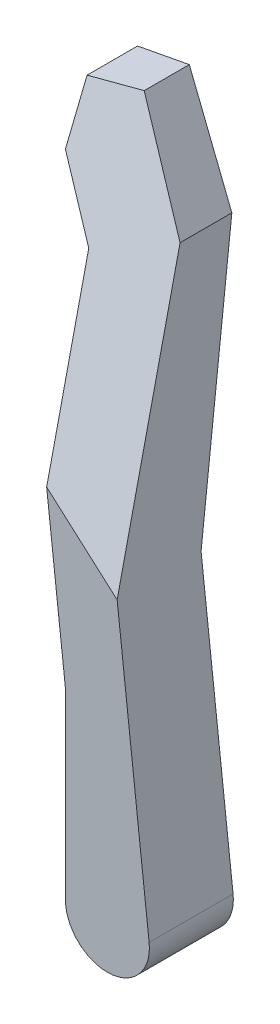
ISO-10303-21;
HEADER;
FILE_DESCRIPTION(('STEP AP214'),'2;1');
FILE_NAME('part.step','',(''),(''),'','','');
FILE_SCHEMA(('AUTOMOTIVE_DESIGN { 1 0 10303 214 1 1 1 1 }'));
ENDSEC;
DATA;
#1=APPLICATION_CONTEXT('core data for automotive mechanical design processes');
#2=APPLICATION_PROTOCOL_DEFINITION('international standard','automotive_design',2000,#1);
#3=PRODUCT_CONTEXT('',#1,'mechanical');
#4=PRODUCT('Part','Part','',(#3));
#5=PRODUCT_RELATED_PRODUCT_CATEGORY('part','',(#4));
#6=PRODUCT_DEFINITION_FORMATION('','',#4);
#7=PRODUCT_DEFINITION_CONTEXT('part definition',#1,'design');
#8=PRODUCT_DEFINITION('design','',#6,#7);
#9=PRODUCT_DEFINITION_SHAPE('','',#8);
#10=(LENGTH_UNIT() NAMED_UNIT(*) SI_UNIT(.MILLI.,.METRE.));
#11=(NAMED_UNIT(*) PLANE_ANGLE_UNIT() SI_UNIT($,.RADIAN.));
#12=(NAMED_UNIT(*) SI_UNIT($,.STERADIAN.) SOLID_ANGLE_UNIT());
#13=UNCERTAINTY_MEASURE_WITH_UNIT(LENGTH_MEASURE(1.E-05),#10,'distance_accuracy_value','');
#14=(GEOMETRIC_REPRESENTATION_CONTEXT(3) GLOBAL_UNCERTAINTY_ASSIGNED_CONTEXT((#13)) GLOBAL_UNIT_ASSIGNED_CONTEXT((#10,
#11,#12)) REPRESENTATION_CONTEXT('',''));
#15=CARTESIAN_POINT('',(0.,0.,0.));
#16=DIRECTION('',(0.,0.,1.));
#17=DIRECTION('',(1.,0.,0.));
#18=AXIS2_PLACEMENT_3D('',#15,#16,#17);
#19=CARTESIAN_POINT('',(0.,0.,-11.));
#20=DIRECTION('',(0.,0.,1.));
#21=DIRECTION('',(1.,0.,0.));
#22=AXIS2_PLACEMENT_3D('',#19,#20,#21);
#23=PLANE('',#22);
#24=DIRECTION('',(-0.748955720788994,0.662620048215747,0.));
#25=VECTOR('',#24,1.);
#26=CARTESIAN_POINT('',(13.9060397522107,15.7179186684468,-11.));
#27=LINE('',#26,#25);
#28=CARTESIAN_POINT('',(0.926709618390554,27.20105995485,-11.));
#29=VERTEX_POINT('',#28);
#30=CARTESIAN_POINT('',(-5.78907095124606,33.1426806960216,-11.));
#31=VERTEX_POINT('',#30);
#32=EDGE_CURVE('E140',#29,#31,#27,.T.);
#33=ORIENTED_EDGE('',*,*,#32,.F.);
#34=DIRECTION('',(-0.1132032137679,0.993571855676588,0.));
#35=VECTOR('',#34,1.);
#36=CARTESIAN_POINT('',(3.97428742270635,0.4528128550716,-11.));
#37=LINE('',#36,#35);
#38=CARTESIAN_POINT('',(3.97428742270635,0.4528128550716,-11.));
#39=VERTEX_POINT('',#38);
#40=EDGE_CURVE('E171',#39,#29,#37,.T.);
#41=ORIENTED_EDGE('',*,*,#40,.F.);
#42=CARTESIAN_POINT('',(0.,0.,-11.));
#43=DIRECTION('',(0.,0.,1.));
#44=DIRECTION('',(1.,0.,0.));
#45=AXIS2_PLACEMENT_3D('',#42,#43,#44);
#46=CIRCLE('',#45,4.);
#47=CARTESIAN_POINT('',(-4.,0.,-11.));
#48=VERTEX_POINT('',#47);
#49=EDGE_CURVE('E145',#48,#39,#46,.T.);
#50=ORIENTED_EDGE('',*,*,#49,.F.);
#51=DIRECTION('',(0.,-1.,0.));
#52=VECTOR('',#51,1.);
#53=CARTESIAN_POINT('',(-4.,17.4402064834858,-11.));
#54=LINE('',#53,#52);
#55=CARTESIAN_POINT('',(-4.,17.4402064834858,-11.));
#56=VERTEX_POINT('',#55);
#57=EDGE_CURVE('E163',#56,#48,#54,.T.);
#58=ORIENTED_EDGE('',*,*,#57,.F.);
#59=DIRECTION('',(0.1132032137679,-0.993571855676588,0.));
#60=VECTOR('',#59,1.);
#61=CARTESIAN_POINT('',(-7.60031647523773,49.0397786357323,-11.));
#62=LINE('',#61,#60);
#63=EDGE_CURVE('E167',#31,#56,#62,.T.);
#64=ORIENTED_EDGE('',*,*,#63,.F.);
#65=EDGE_LOOP('',(#33,#41,#50,#58,#64));
#66=FACE_BOUND('',#65,.T.);
#67=ADVANCED_FACE('F43',(#66),#23,.F.);
#68=CARTESIAN_POINT('',(0.,0.,-11.));
#69=DIRECTION('',(0.,0.,1.));
#70=DIRECTION('',(1.,0.,0.));
#71=AXIS2_PLACEMENT_3D('',#68,#69,#70);
#72=CYLINDRICAL_SURFACE('',#71,4.);
#73=CARTESIAN_POINT('',(0.,0.,-3.));
#74=DIRECTION('',(0.,0.,1.));
#75=DIRECTION('',(1.,0.,0.));
#76=AXIS2_PLACEMENT_3D('',#73,#74,#75);
#77=CIRCLE('',#76,4.);
#78=CARTESIAN_POINT('',(-4.,0.,-3.));
#79=VERTEX_POINT('',#78);
#80=CARTESIAN_POINT('',(3.97428742270635,0.4528128550716,-3.));
#81=VERTEX_POINT('',#80);
#82=EDGE_CURVE('E135',#79,#81,#77,.T.);
#83=ORIENTED_EDGE('',*,*,#82,.F.);
#84=DIRECTION('',(0.,0.,1.));
#85=VECTOR('',#84,1.);
#86=CARTESIAN_POINT('',(-4.,0.,-11.));
#87=LINE('',#86,#85);
#88=EDGE_CURVE('E51',#48,#79,#87,.T.);
#89=ORIENTED_EDGE('',*,*,#88,.F.);
#90=ORIENTED_EDGE('',*,*,#49,.T.);
#91=DIRECTION('',(0.,0.,1.));
#92=VECTOR('',#91,1.);
#93=CARTESIAN_POINT('',(3.97428742270635,0.4528128550716,-11.));
#94=LINE('',#93,#92);
#95=EDGE_CURVE('E162',#39,#81,#94,.T.);
#96=ORIENTED_EDGE('',*,*,#95,.T.);
#97=EDGE_LOOP('',(#83,#89,#90,#96));
#98=FACE_BOUND('',#97,.T.);
#99=ADVANCED_FACE('F45',(#98),#72,.T.);
#100=CARTESIAN_POINT('',(-4.,17.4402064834858,-11.));
#101=DIRECTION('',(-1.,0.,0.));
#102=DIRECTION('',(0.,-1.,0.));
#103=AXIS2_PLACEMENT_3D('',#100,#101,#102);
#104=PLANE('',#103);
#105=DIRECTION('',(0.,-1.,0.));
#106=VECTOR('',#105,1.);
#107=CARTESIAN_POINT('',(-4.,17.4402064834858,-3.));
#108=LINE('',#107,#106);
#109=CARTESIAN_POINT('',(-4.,17.4402064834858,-3.));
#110=VERTEX_POINT('',#109);
#111=EDGE_CURVE('E138',#110,#79,#108,.T.);
#112=ORIENTED_EDGE('',*,*,#111,.F.);
#113=DIRECTION('',(0.,0.,1.));
#114=VECTOR('',#113,1.);
#115=CARTESIAN_POINT('',(-4.,17.4402064834858,-11.));
#116=LINE('',#115,#114);
#117=EDGE_CURVE('E147',#56,#110,#116,.T.);
#118=ORIENTED_EDGE('',*,*,#117,.F.);
#119=ORIENTED_EDGE('',*,*,#57,.T.);
#120=ORIENTED_EDGE('',*,*,#88,.T.);
#121=EDGE_LOOP('',(#112,#118,#119,#120));
#122=FACE_BOUND('',#121,.T.);
#123=ADVANCED_FACE('F223',(#122),#104,.T.);
#124=CARTESIAN_POINT('',(-7.60031647523773,49.0397786357323,-11.));
#125=DIRECTION('',(-0.993571855676588,-0.1132032137679,0.));
#126=DIRECTION('',(0.1132032137679,-0.993571855676588,0.));
#127=AXIS2_PLACEMENT_3D('',#124,#125,#126);
#128=PLANE('',#127);
#129=DIRECTION('',(0.106376224626946,-0.933652140999854,0.342020143325663));
#130=VECTOR('',#129,1.);
#131=CARTESIAN_POINT('',(-7.67950349037768,49.7347941477424,-9.07810636492087));
#132=LINE('',#131,#130);
#133=CARTESIAN_POINT('',(-7.60031647523773,49.0397786357323,-8.82350479053075));
#134=VERTEX_POINT('',#133);
#135=CARTESIAN_POINT('',(-5.78907095124606,33.1426806960216,-3.));
#136=VERTEX_POINT('',#135);
#137=EDGE_CURVE('E57',#134,#136,#132,.T.);
#138=ORIENTED_EDGE('',*,*,#137,.F.);
#139=DIRECTION('',(0.,0.,1.));
#140=VECTOR('',#139,1.);
#141=CARTESIAN_POINT('',(-7.60031647523773,49.0397786357323,-11.));
#142=LINE('',#141,#140);
#143=CARTESIAN_POINT('',(-7.60031647523773,49.0397786357323,-14.7715439060675));
#144=VERTEX_POINT('',#143);
#145=EDGE_CURVE('E150',#144,#134,#142,.T.);
#146=ORIENTED_EDGE('',*,*,#145,.F.);
#147=DIRECTION('',(-0.110183425164921,0.967067511266677,-0.229434176772774));
#148=VECTOR('',#147,1.);
#149=CARTESIAN_POINT('',(-7.50497243573992,48.202954740911,-14.5730096784409));
#150=LINE('',#149,#148);
#151=EDGE_CURVE('E187',#31,#144,#150,.T.);
#152=ORIENTED_EDGE('',*,*,#151,.F.);
#153=ORIENTED_EDGE('',*,*,#63,.T.);
#154=ORIENTED_EDGE('',*,*,#117,.T.);
#155=DIRECTION('',(0.1132032137679,-0.993571855676588,0.));
#156=VECTOR('',#155,1.);
#157=CARTESIAN_POINT('',(-7.60031647523773,49.0397786357323,-3.));
#158=LINE('',#157,#156);
#159=EDGE_CURVE('E136',#136,#110,#158,.T.);
#160=ORIENTED_EDGE('',*,*,#159,.F.);
#161=EDGE_LOOP('',(#138,#146,#152,#153,#154,#160));
#162=FACE_BOUND('',#161,.T.);
#163=ADVANCED_FACE('F220',(#162),#128,.T.);
#164=CARTESIAN_POINT('',(-11.,54.9282032302755,-11.));
#165=DIRECTION('',(-0.866025403784442,-0.499999999999995,0.));
#166=DIRECTION('',(0.499999999999995,-0.866025403784442,0.));
#167=AXIS2_PLACEMENT_3D('',#164,#165,#166);
#168=PLANE('',#167);
#169=DIRECTION('',(0.492714995661003,-0.853407406135947,0.170081545745248));
#170=VECTOR('',#169,1.);
#171=CARTESIAN_POINT('',(-11.0840489251185,55.0737802389022,-10.0260632782092));
#172=LINE('',#171,#170);
#173=CARTESIAN_POINT('',(-11.,54.9282032302755,-9.99705021542797));
#174=VERTEX_POINT('',#173);
#175=EDGE_CURVE('E179',#174,#134,#172,.T.);
#176=ORIENTED_EDGE('',*,*,#175,.F.);
#177=DIRECTION('',(0.,0.,1.));
#178=VECTOR('',#177,1.);
#179=CARTESIAN_POINT('',(-11.,54.9282032302755,-11.));
#180=LINE('',#179,#178);
#181=CARTESIAN_POINT('',(-11.,54.9282032302755,-15.5315807318226));
#182=VERTEX_POINT('',#181);
#183=EDGE_CURVE('E153',#182,#174,#180,.T.);
#184=ORIENTED_EDGE('',*,*,#183,.F.);
#185=DIRECTION('',(-0.496905249899788,0.860665139374154,-0.111088660483854));
#186=VECTOR('',#185,1.);
#187=CARTESIAN_POINT('',(-10.7498543028996,54.4949381736029,-15.4756578965893));
#188=LINE('',#187,#186);
#189=EDGE_CURVE('E189',#144,#182,#188,.T.);
#190=ORIENTED_EDGE('',*,*,#189,.F.);
#191=ORIENTED_EDGE('',*,*,#145,.T.);
#192=EDGE_LOOP('',(#176,#184,#190,#191));
#193=FACE_BOUND('',#192,.T.);
#194=ADVANCED_FACE('F215',(#193),#168,.T.);
#195=CARTESIAN_POINT('',(-11.,60.,-11.));
#196=DIRECTION('',(-1.,0.,0.));
#197=DIRECTION('',(0.,0.,1.));
#198=AXIS2_PLACEMENT_3D('',#195,#196,#197);
#199=PLANE('',#198);
#200=DIRECTION('',(0.,-0.926097764547836,0.377283620767586));
#201=VECTOR('',#200,1.);
#202=CARTESIAN_POINT('',(-11.,59.6284977618995,-11.9119065161891));
#203=LINE('',#202,#201);
#204=CARTESIAN_POINT('',(-11.,60.,-12.0632530747052));
#205=VERTEX_POINT('',#204);
#206=EDGE_CURVE('E181',#205,#174,#203,.T.);
#207=ORIENTED_EDGE('',*,*,#206,.F.);
#208=DIRECTION('',(0.,0.,1.));
#209=VECTOR('',#208,1.);
#210=CARTESIAN_POINT('',(-11.,60.,-11.));
#211=LINE('',#210,#209);
#212=CARTESIAN_POINT('',(-11.,60.,-16.8697396383418));
#213=VERTEX_POINT('',#212);
#214=EDGE_CURVE('E156',#213,#205,#211,.T.);
#215=ORIENTED_EDGE('',*,*,#214,.F.);
#216=DIRECTION('',(0.,0.966911264947976,-0.255112927380611));
#217=VECTOR('',#216,1.);
#218=CARTESIAN_POINT('',(-11.,58.5521021471396,-16.4877216877999));
#219=LINE('',#218,#217);
#220=EDGE_CURVE('E191',#182,#213,#219,.T.);
#221=ORIENTED_EDGE('',*,*,#220,.F.);
#222=ORIENTED_EDGE('',*,*,#183,.T.);
#223=EDGE_LOOP('',(#207,#215,#221,#222));
#224=FACE_BOUND('',#223,.T.);
#225=ADVANCED_FACE('F211',(#224),#199,.T.);
#226=CARTESIAN_POINT('',(-7.00000000000001,60.,-11.));
#227=DIRECTION('',(0.,1.,0.));
#228=DIRECTION('',(0.,0.,1.));
#229=AXIS2_PLACEMENT_3D('',#226,#227,#228);
#230=PLANE('',#229);
#231=DIRECTION('',(-0.940758767954672,0.,0.339076599777111));
#232=VECTOR('',#231,1.);
#233=CARTESIAN_POINT('',(-7.79905809934095,60.,-13.2169648791876));
#234=LINE('',#233,#232);
#235=CARTESIAN_POINT('',(-7.00000000000001,60.,-13.5049684700953));
#236=VERTEX_POINT('',#235);
#237=EDGE_CURVE('E183',#236,#205,#234,.T.);
#238=ORIENTED_EDGE('',*,*,#237,.F.);
#239=DIRECTION('',(0.,0.,1.));
#240=VECTOR('',#239,1.);
#241=CARTESIAN_POINT('',(-7.00000000000001,60.,-11.));
#242=LINE('',#241,#240);
#243=CARTESIAN_POINT('',(-7.00000000000001,60.,-17.8034544903685));
#244=VERTEX_POINT('',#243);
#245=EDGE_CURVE('E159',#244,#236,#242,.T.);
#246=ORIENTED_EDGE('',*,*,#245,.F.);
#247=DIRECTION('',(0.973820652158254,0.,-0.227317701532618));
#248=VECTOR('',#247,1.);
#249=CARTESIAN_POINT('',(-8.5060580810421,60.,-17.4518972907976));
#250=LINE('',#249,#248);
#251=EDGE_CURVE('E193',#213,#244,#250,.T.);
#252=ORIENTED_EDGE('',*,*,#251,.F.);
#253=ORIENTED_EDGE('',*,*,#214,.T.);
#254=EDGE_LOOP('',(#238,#246,#252,#253));
#255=FACE_BOUND('',#254,.T.);
#256=ADVANCED_FACE('F207',(#255),#230,.T.);
#257=CARTESIAN_POINT('',(-1.78016315513645,50.9589773774762,-11.));
#258=DIRECTION('',(0.866025403784441,0.499999999999995,0.));
#259=DIRECTION('',(-0.499999999999995,0.866025403784441,0.));
#260=AXIS2_PLACEMENT_3D('',#257,#258,#259);
#261=PLANE('',#260);
#262=DIRECTION('',(-0.492714995661003,0.853407406135947,-0.170081545745248));
#263=VECTOR('',#262,1.);
#264=CARTESIAN_POINT('',(-1.72124051096392,50.856920364053,-11.6827800215619));
#265=LINE('',#264,#263);
#266=CARTESIAN_POINT('',(-1.78016315513645,50.9589773774762,-11.703119679353));
#267=VERTEX_POINT('',#266);
#268=EDGE_CURVE('E185',#267,#236,#265,.T.);
#269=ORIENTED_EDGE('',*,*,#268,.F.);
#270=DIRECTION('',(0.,0.,1.));
#271=VECTOR('',#270,1.);
#272=CARTESIAN_POINT('',(-1.78016315513645,50.9589773774762,-11.));
#273=LINE('',#272,#271);
#274=CARTESIAN_POINT('',(-1.78016315513645,50.9589773774762,-16.6365022733068));
#275=VERTEX_POINT('',#274);
#276=EDGE_CURVE('E130',#275,#267,#273,.T.);
#277=ORIENTED_EDGE('',*,*,#276,.F.);
#278=DIRECTION('',(0.496905249899788,-0.860665139374154,0.111088660483854));
#279=VECTOR('',#278,1.);
#280=CARTESIAN_POINT('',(-1.46902519383677,50.4200706203417,-16.5669439433165));
#281=LINE('',#280,#279);
#282=EDGE_CURVE('E195',#244,#275,#281,.T.);
#283=ORIENTED_EDGE('',*,*,#282,.F.);
#284=ORIENTED_EDGE('',*,*,#245,.T.);
#285=EDGE_LOOP('',(#269,#277,#283,#284));
#286=FACE_BOUND('',#285,.T.);
#287=ADVANCED_FACE('F203',(#286),#261,.T.);
#288=CARTESIAN_POINT('',(3.97428742270635,0.4528128550716,-11.));
#289=DIRECTION('',(0.993571855676588,0.1132032137679,0.));
#290=DIRECTION('',(-0.1132032137679,0.993571855676588,0.));
#291=AXIS2_PLACEMENT_3D('',#288,#289,#290);
#292=PLANE('',#291);
#293=DIRECTION('',(-0.106376224626946,0.933652140999854,-0.342020143325663));
#294=VECTOR('',#293,1.);
#295=CARTESIAN_POINT('',(-2.91520885129039,60.9211455975199,-15.3525111955603));
#296=LINE('',#295,#294);
#297=CARTESIAN_POINT('',(0.926709618390555,27.20105995485,-3.));
#298=VERTEX_POINT('',#297);
#299=EDGE_CURVE('E118',#298,#267,#296,.T.);
#300=ORIENTED_EDGE('',*,*,#299,.F.);
#301=DIRECTION('',(-0.1132032137679,0.993571855676588,0.));
#302=VECTOR('',#301,1.);
#303=CARTESIAN_POINT('',(3.97428742270635,0.4528128550716,-3.));
#304=LINE('',#303,#302);
#305=EDGE_CURVE('E127',#81,#298,#304,.T.);
#306=ORIENTED_EDGE('',*,*,#305,.F.);
#307=ORIENTED_EDGE('',*,*,#95,.F.);
#308=ORIENTED_EDGE('',*,*,#40,.T.);
#309=DIRECTION('',(0.110183425164921,-0.967067511266678,0.229434176772775));
#310=VECTOR('',#309,1.);
#311=CARTESIAN_POINT('',(0.926709618390555,27.20105995485,-11.));
#312=LINE('',#311,#310);
#313=EDGE_CURVE('E65',#275,#29,#312,.T.);
#314=ORIENTED_EDGE('',*,*,#313,.F.);
#315=ORIENTED_EDGE('',*,*,#276,.T.);
#316=EDGE_LOOP('',(#300,#306,#307,#308,#314,#315));
#317=FACE_BOUND('',#316,.T.);
#318=ADVANCED_FACE('F126',(#317),#292,.T.);
#319=CARTESIAN_POINT('',(0.,0.,-3.));
#320=DIRECTION('',(0.,0.,1.));
#321=DIRECTION('',(1.,0.,0.));
#322=AXIS2_PLACEMENT_3D('',#319,#320,#321);
#323=PLANE('',#322);
#324=DIRECTION('',(0.748955720788994,-0.662620048215747,0.));
#325=VECTOR('',#324,1.);
#326=CARTESIAN_POINT('',(13.9060397522107,15.7179186684468,-3.));
#327=LINE('',#326,#325);
#328=EDGE_CURVE('E11',#136,#298,#327,.T.);
#329=ORIENTED_EDGE('',*,*,#328,.F.);
#330=ORIENTED_EDGE('',*,*,#159,.T.);
#331=ORIENTED_EDGE('',*,*,#111,.T.);
#332=ORIENTED_EDGE('',*,*,#82,.T.);
#333=ORIENTED_EDGE('',*,*,#305,.T.);
#334=EDGE_LOOP('',(#329,#330,#331,#332,#333));
#335=FACE_BOUND('',#334,.T.);
#336=ADVANCED_FACE('F132',(#335),#323,.T.);
#337=CARTESIAN_POINT('',(-22.0406261857572,47.5208422003204,-11.));
#338=DIRECTION('',(0.22016657211218,0.248853040522901,0.943185477383362));
#339=DIRECTION('',(0.,-0.966911264947976,0.255112927380611));
#340=AXIS2_PLACEMENT_3D('',#337,#338,#339);
#341=PLANE('',#340);
#342=ORIENTED_EDGE('',*,*,#151,.T.);
#343=ORIENTED_EDGE('',*,*,#189,.T.);
#344=ORIENTED_EDGE('',*,*,#220,.T.);
#345=ORIENTED_EDGE('',*,*,#251,.T.);
#346=ORIENTED_EDGE('',*,*,#282,.T.);
#347=ORIENTED_EDGE('',*,*,#313,.T.);
#348=ORIENTED_EDGE('',*,*,#32,.T.);
#349=EDGE_LOOP('',(#342,#343,#344,#345,#346,#347,#348));
#350=FACE_BOUND('',#349,.T.);
#351=ADVANCED_FACE('F198',(#350),#341,.F.);
#352=CARTESIAN_POINT('',(-25.8825446554381,81.2409278429903,-15.3525111955603));
#353=DIRECTION('',(-0.316619601366845,-0.357873358037031,-0.878452439029911));
#354=DIRECTION('',(0.,0.926097764547836,-0.377283620767586));
#355=AXIS2_PLACEMENT_3D('',#352,#353,#354);
#356=PLANE('',#355);
#357=ORIENTED_EDGE('',*,*,#137,.T.);
#358=ORIENTED_EDGE('',*,*,#328,.T.);
#359=ORIENTED_EDGE('',*,*,#299,.T.);
#360=ORIENTED_EDGE('',*,*,#268,.T.);
#361=ORIENTED_EDGE('',*,*,#237,.T.);
#362=ORIENTED_EDGE('',*,*,#206,.T.);
#363=ORIENTED_EDGE('',*,*,#175,.T.);
#364=EDGE_LOOP('',(#357,#358,#359,#360,#361,#362,#363));
#365=FACE_BOUND('',#364,.T.);
#366=ADVANCED_FACE('F117',(#365),#356,.F.);
#367=CLOSED_SHELL('',(#67,#99,#123,#163,#194,#225,#256,#287,#318,#336,#351,#366));
#368=MANIFOLD_SOLID_BREP('B2',#367);
#369=ADVANCED_BREP_SHAPE_REPRESENTATION('',(#18,#368),#14);
#370=SHAPE_DEFINITION_REPRESENTATION(#9,#369);
ENDSEC;
END-ISO-10303-21;
